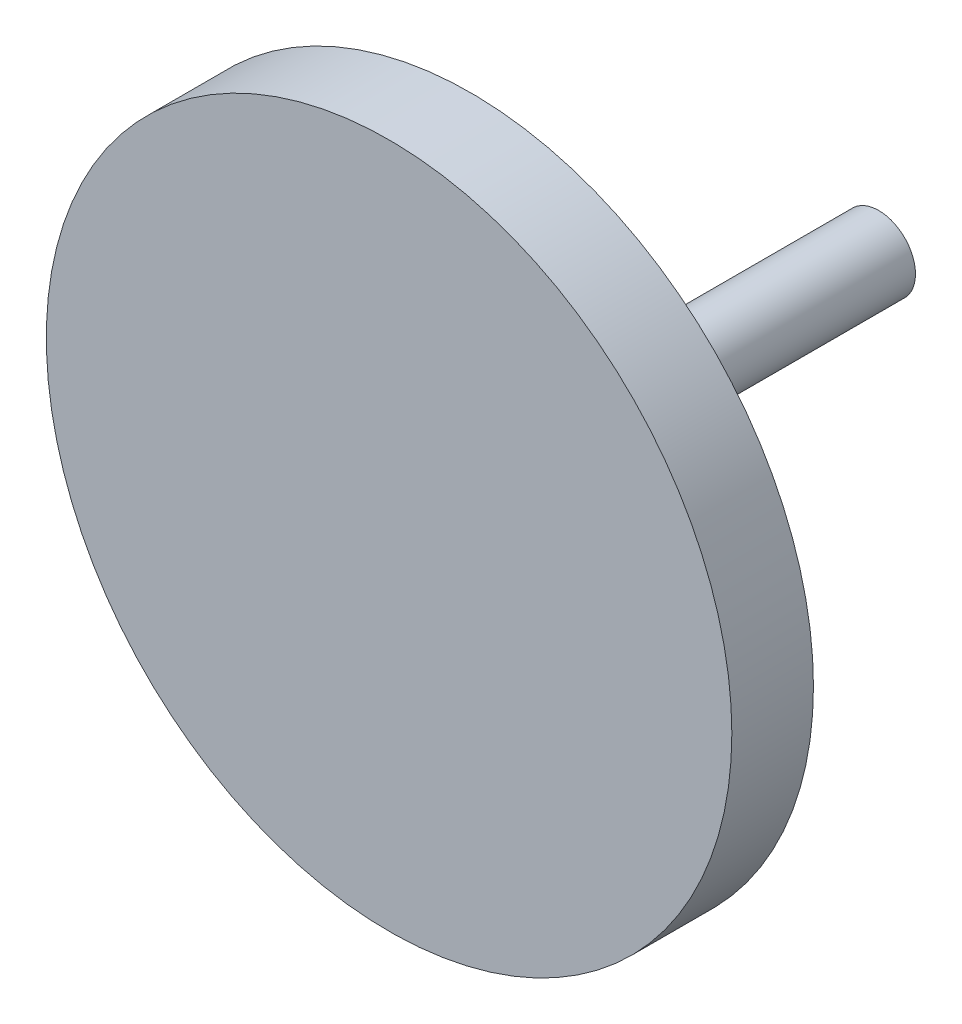
ISO-10303-21;
HEADER;
FILE_DESCRIPTION(('STEP AP214'),'2;1');
FILE_NAME('part.step','',(''),(''),'','','');
FILE_SCHEMA(('AUTOMOTIVE_DESIGN { 1 0 10303 214 1 1 1 1 }'));
ENDSEC;
DATA;
#1=APPLICATION_CONTEXT('core data for automotive mechanical design processes');
#2=APPLICATION_PROTOCOL_DEFINITION('international standard','automotive_design',2000,#1);
#3=PRODUCT_CONTEXT('',#1,'mechanical');
#4=PRODUCT('Part','Part','',(#3));
#5=PRODUCT_RELATED_PRODUCT_CATEGORY('part','',(#4));
#6=PRODUCT_DEFINITION_FORMATION('','',#4);
#7=PRODUCT_DEFINITION_CONTEXT('part definition',#1,'design');
#8=PRODUCT_DEFINITION('design','',#6,#7);
#9=PRODUCT_DEFINITION_SHAPE('','',#8);
#10=(LENGTH_UNIT() NAMED_UNIT(*) SI_UNIT(.MILLI.,.METRE.));
#11=(NAMED_UNIT(*) PLANE_ANGLE_UNIT() SI_UNIT($,.RADIAN.));
#12=(NAMED_UNIT(*) SI_UNIT($,.STERADIAN.) SOLID_ANGLE_UNIT());
#13=UNCERTAINTY_MEASURE_WITH_UNIT(LENGTH_MEASURE(1.E-05),#10,'distance_accuracy_value','');
#14=(GEOMETRIC_REPRESENTATION_CONTEXT(3) GLOBAL_UNCERTAINTY_ASSIGNED_CONTEXT((#13)) GLOBAL_UNIT_ASSIGNED_CONTEXT((#10,
#11,#12)) REPRESENTATION_CONTEXT('',''));
#15=CARTESIAN_POINT('',(0.,0.,0.));
#16=DIRECTION('',(0.,0.,1.));
#17=DIRECTION('',(1.,0.,0.));
#18=AXIS2_PLACEMENT_3D('',#15,#16,#17);
#19=CARTESIAN_POINT('',(0.,0.,15.));
#20=DIRECTION('',(0.,0.,-1.));
#21=DIRECTION('',(-1.,0.,0.));
#22=AXIS2_PLACEMENT_3D('',#19,#20,#21);
#23=CYLINDRICAL_SURFACE('',#22,2.25);
#24=CARTESIAN_POINT('',(0.,0.,-15.));
#25=DIRECTION('',(0.,0.,1.));
#26=DIRECTION('',(1.,0.,0.));
#27=AXIS2_PLACEMENT_3D('',#24,#25,#26);
#28=CIRCLE('',#27,2.25);
#29=CARTESIAN_POINT('',(2.25,0.,-15.));
#30=VERTEX_POINT('',#29);
#31=EDGE_CURVE('E50',#30,#30,#28,.T.);
#32=ORIENTED_EDGE('',*,*,#31,.T.);
#33=EDGE_LOOP('',(#32));
#34=FACE_BOUND('',#33,.T.);
#35=CARTESIAN_POINT('',(0.,0.,10.));
#36=DIRECTION('',(0.,0.,1.));
#37=DIRECTION('',(1.,0.,0.));
#38=AXIS2_PLACEMENT_3D('',#35,#36,#37);
#39=CIRCLE('',#38,2.25);
#40=CARTESIAN_POINT('',(2.25,0.,10.));
#41=VERTEX_POINT('',#40);
#42=EDGE_CURVE('E10',#41,#41,#39,.T.);
#43=ORIENTED_EDGE('',*,*,#42,.F.);
#44=EDGE_LOOP('',(#43));
#45=FACE_BOUND('',#44,.T.);
#46=ADVANCED_FACE('F43',(#34,#45),#23,.T.);
#47=CARTESIAN_POINT('',(0.,0.,-15.));
#48=DIRECTION('',(0.,0.,1.));
#49=DIRECTION('',(1.,0.,0.));
#50=AXIS2_PLACEMENT_3D('',#47,#48,#49);
#51=PLANE('',#50);
#52=ORIENTED_EDGE('',*,*,#31,.F.);
#53=EDGE_LOOP('',(#52));
#54=FACE_BOUND('',#53,.T.);
#55=ADVANCED_FACE('F72',(#54),#51,.F.);
#56=CARTESIAN_POINT('',(0.,0.,10.));
#57=DIRECTION('',(0.,0.,1.));
#58=DIRECTION('',(1.,0.,0.));
#59=AXIS2_PLACEMENT_3D('',#56,#57,#58);
#60=CYLINDRICAL_SURFACE('',#59,21.);
#61=CARTESIAN_POINT('',(0.,0.,10.));
#62=DIRECTION('',(0.,0.,1.));
#63=DIRECTION('',(1.,0.,0.));
#64=AXIS2_PLACEMENT_3D('',#61,#62,#63);
#65=CIRCLE('',#64,21.);
#66=CARTESIAN_POINT('',(21.,0.,10.));
#67=VERTEX_POINT('',#66);
#68=EDGE_CURVE('E55',#67,#67,#65,.T.);
#69=ORIENTED_EDGE('',*,*,#68,.T.);
#70=EDGE_LOOP('',(#69));
#71=FACE_BOUND('',#70,.T.);
#72=CARTESIAN_POINT('',(0.,0.,15.));
#73=DIRECTION('',(0.,0.,1.));
#74=DIRECTION('',(1.,0.,0.));
#75=AXIS2_PLACEMENT_3D('',#72,#73,#74);
#76=CIRCLE('',#75,21.);
#77=CARTESIAN_POINT('',(21.,0.,15.));
#78=VERTEX_POINT('',#77);
#79=EDGE_CURVE('E60',#78,#78,#76,.T.);
#80=ORIENTED_EDGE('',*,*,#79,.F.);
#81=EDGE_LOOP('',(#80));
#82=FACE_BOUND('',#81,.T.);
#83=ADVANCED_FACE('F69',(#71,#82),#60,.T.);
#84=CARTESIAN_POINT('',(0.,0.,10.));
#85=DIRECTION('',(0.,0.,1.));
#86=DIRECTION('',(1.,0.,0.));
#87=AXIS2_PLACEMENT_3D('',#84,#85,#86);
#88=PLANE('',#87);
#89=ORIENTED_EDGE('',*,*,#42,.T.);
#90=EDGE_LOOP('',(#89));
#91=FACE_BOUND('',#90,.T.);
#92=ORIENTED_EDGE('',*,*,#68,.F.);
#93=EDGE_LOOP('',(#92));
#94=FACE_BOUND('',#93,.T.);
#95=ADVANCED_FACE('F71',(#91,#94),#88,.F.);
#96=CARTESIAN_POINT('',(0.,0.,15.));
#97=DIRECTION('',(0.,0.,1.));
#98=DIRECTION('',(1.,0.,0.));
#99=AXIS2_PLACEMENT_3D('',#96,#97,#98);
#100=PLANE('',#99);
#101=ORIENTED_EDGE('',*,*,#79,.T.);
#102=EDGE_LOOP('',(#101));
#103=FACE_BOUND('',#102,.T.);
#104=ADVANCED_FACE('F67',(#103),#100,.T.);
#105=CLOSED_SHELL('',(#46,#55,#83,#95,#104));
#106=MANIFOLD_SOLID_BREP('B2',#105);
#107=ADVANCED_BREP_SHAPE_REPRESENTATION('',(#18,#106),#14);
#108=SHAPE_DEFINITION_REPRESENTATION(#9,#107);
ENDSEC;
END-ISO-10303-21;
